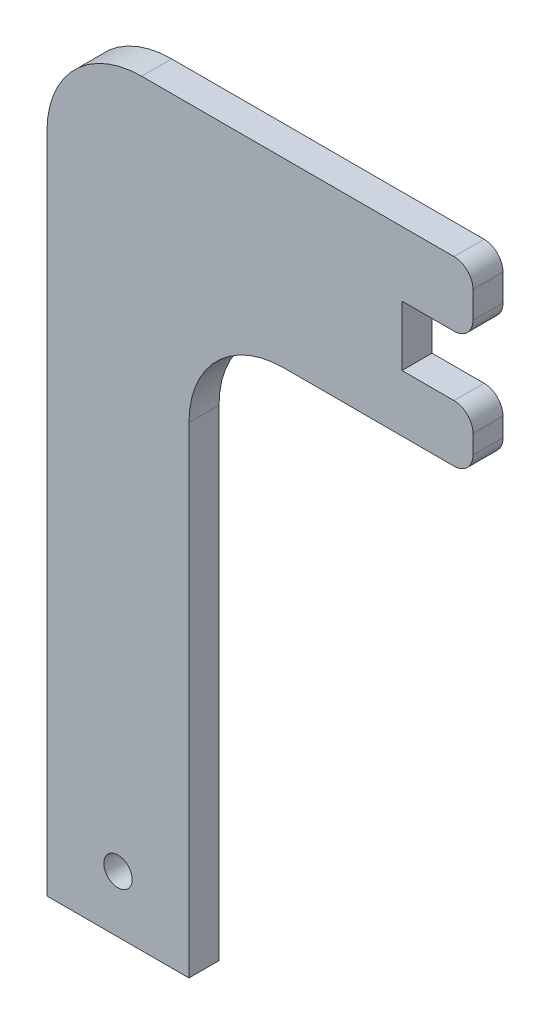
ISO-10303-21;
HEADER;
FILE_DESCRIPTION(('STEP AP214'),'2;1');
FILE_NAME('part.step','',(''),(''),'','','');
FILE_SCHEMA(('AUTOMOTIVE_DESIGN { 1 0 10303 214 1 1 1 1 }'));
ENDSEC;
DATA;
#1=APPLICATION_CONTEXT('core data for automotive mechanical design processes');
#2=APPLICATION_PROTOCOL_DEFINITION('international standard','automotive_design',2000,#1);
#3=PRODUCT_CONTEXT('',#1,'mechanical');
#4=PRODUCT('Part','Part','',(#3));
#5=PRODUCT_RELATED_PRODUCT_CATEGORY('part','',(#4));
#6=PRODUCT_DEFINITION_FORMATION('','',#4);
#7=PRODUCT_DEFINITION_CONTEXT('part definition',#1,'design');
#8=PRODUCT_DEFINITION('design','',#6,#7);
#9=PRODUCT_DEFINITION_SHAPE('','',#8);
#10=(LENGTH_UNIT() NAMED_UNIT(*) SI_UNIT(.MILLI.,.METRE.));
#11=(NAMED_UNIT(*) PLANE_ANGLE_UNIT() SI_UNIT($,.RADIAN.));
#12=(NAMED_UNIT(*) SI_UNIT($,.STERADIAN.) SOLID_ANGLE_UNIT());
#13=UNCERTAINTY_MEASURE_WITH_UNIT(LENGTH_MEASURE(1.E-05),#10,'distance_accuracy_value','');
#14=(GEOMETRIC_REPRESENTATION_CONTEXT(3) GLOBAL_UNCERTAINTY_ASSIGNED_CONTEXT((#13)) GLOBAL_UNIT_ASSIGNED_CONTEXT((#10,
#11,#12)) REPRESENTATION_CONTEXT('',''));
#15=CARTESIAN_POINT('',(0.,0.,0.));
#16=DIRECTION('',(0.,0.,1.));
#17=DIRECTION('',(1.,0.,0.));
#18=AXIS2_PLACEMENT_3D('',#15,#16,#17);
#19=CARTESIAN_POINT('',(0.,0.,3.175));
#20=DIRECTION('',(-1.,0.,0.));
#21=DIRECTION('',(0.,-1.,0.));
#22=AXIS2_PLACEMENT_3D('',#19,#20,#21);
#23=PLANE('',#22);
#24=DIRECTION('',(0.,1.,0.));
#25=VECTOR('',#24,1.);
#26=CARTESIAN_POINT('',(0.,0.,3.175));
#27=LINE('',#26,#25);
#28=CARTESIAN_POINT('',(0.,-17.175,3.175));
#29=VERTEX_POINT('',#28);
#30=CARTESIAN_POINT('',(0.,-15.175,3.175));
#31=VERTEX_POINT('',#30);
#32=EDGE_CURVE('E190',#29,#31,#27,.T.);
#33=ORIENTED_EDGE('',*,*,#32,.F.);
#34=DIRECTION('',(0.,0.,1.));
#35=VECTOR('',#34,1.);
#36=CARTESIAN_POINT('',(0.,-17.175,3.175));
#37=LINE('',#36,#35);
#38=CARTESIAN_POINT('',(0.,-17.175,0.));
#39=VERTEX_POINT('',#38);
#40=EDGE_CURVE('E250',#29,#39,#37,.F.);
#41=ORIENTED_EDGE('',*,*,#40,.T.);
#42=DIRECTION('',(0.,1.,0.));
#43=VECTOR('',#42,1.);
#44=CARTESIAN_POINT('',(0.,0.,0.));
#45=LINE('',#44,#43);
#46=CARTESIAN_POINT('',(0.,-15.175,0.));
#47=VERTEX_POINT('',#46);
#48=EDGE_CURVE('E294',#39,#47,#45,.T.);
#49=ORIENTED_EDGE('',*,*,#48,.T.);
#50=DIRECTION('',(0.,0.,1.));
#51=VECTOR('',#50,1.);
#52=CARTESIAN_POINT('',(0.,-15.175,3.175));
#53=LINE('',#52,#51);
#54=EDGE_CURVE('E246',#47,#31,#53,.T.);
#55=ORIENTED_EDGE('',*,*,#54,.T.);
#56=EDGE_LOOP('',(#33,#41,#49,#55));
#57=FACE_BOUND('',#56,.T.);
#58=ADVANCED_FACE('F38',(#57),#23,.F.);
#59=CARTESIAN_POINT('',(0.,-4.825,0.));
#60=VERTEX_POINT('',#59);
#61=CARTESIAN_POINT('',(0.,-2.,0.));
#62=VERTEX_POINT('',#61);
#63=EDGE_CURVE('E291',#60,#62,#45,.T.);
#64=ORIENTED_EDGE('',*,*,#63,.T.);
#65=DIRECTION('',(0.,0.,-1.));
#66=VECTOR('',#65,1.);
#67=CARTESIAN_POINT('',(0.,-2.,3.175));
#68=LINE('',#67,#66);
#69=CARTESIAN_POINT('',(0.,-2.,3.175));
#70=VERTEX_POINT('',#69);
#71=EDGE_CURVE('E272',#62,#70,#68,.F.);
#72=ORIENTED_EDGE('',*,*,#71,.T.);
#73=CARTESIAN_POINT('',(0.,-4.825,3.175));
#74=VERTEX_POINT('',#73);
#75=EDGE_CURVE('E184',#74,#70,#27,.T.);
#76=ORIENTED_EDGE('',*,*,#75,.F.);
#77=DIRECTION('',(0.,0.,-1.));
#78=VECTOR('',#77,1.);
#79=CARTESIAN_POINT('',(0.,-4.825,3.175));
#80=LINE('',#79,#78);
#81=EDGE_CURVE('E268',#74,#60,#80,.T.);
#82=ORIENTED_EDGE('',*,*,#81,.T.);
#83=EDGE_LOOP('',(#64,#72,#76,#82));
#84=FACE_BOUND('',#83,.T.);
#85=ADVANCED_FACE('F344',(#84),#23,.F.);
#86=CARTESIAN_POINT('',(0.,0.,3.175));
#87=DIRECTION('',(0.,-1.,0.));
#88=DIRECTION('',(1.,0.,0.));
#89=AXIS2_PLACEMENT_3D('',#86,#87,#88);
#90=PLANE('',#89);
#91=DIRECTION('',(-1.,0.,0.));
#92=VECTOR('',#91,1.);
#93=CARTESIAN_POINT('',(0.,0.,3.175));
#94=LINE('',#93,#92);
#95=CARTESIAN_POINT('',(-2.,0.,3.175));
#96=VERTEX_POINT('',#95);
#97=CARTESIAN_POINT('',(-35.,0.,3.175));
#98=VERTEX_POINT('',#97);
#99=EDGE_CURVE('E280',#96,#98,#94,.T.);
#100=ORIENTED_EDGE('',*,*,#99,.F.);
#101=DIRECTION('',(0.,0.,-1.));
#102=VECTOR('',#101,1.);
#103=CARTESIAN_POINT('',(-2.,0.,3.175));
#104=LINE('',#103,#102);
#105=CARTESIAN_POINT('',(-2.,0.,0.));
#106=VERTEX_POINT('',#105);
#107=EDGE_CURVE('E264',#96,#106,#104,.T.);
#108=ORIENTED_EDGE('',*,*,#107,.T.);
#109=DIRECTION('',(-1.,0.,0.));
#110=VECTOR('',#109,1.);
#111=CARTESIAN_POINT('',(0.,0.,0.));
#112=LINE('',#111,#110);
#113=CARTESIAN_POINT('',(-35.,0.,0.));
#114=VERTEX_POINT('',#113);
#115=EDGE_CURVE('E192',#106,#114,#112,.T.);
#116=ORIENTED_EDGE('',*,*,#115,.T.);
#117=DIRECTION('',(0.,0.,-1.));
#118=VECTOR('',#117,1.);
#119=CARTESIAN_POINT('',(-35.,0.,3.175));
#120=LINE('',#119,#118);
#121=EDGE_CURVE('E210',#114,#98,#120,.F.);
#122=ORIENTED_EDGE('',*,*,#121,.T.);
#123=EDGE_LOOP('',(#100,#108,#116,#122));
#124=FACE_BOUND('',#123,.T.);
#125=ADVANCED_FACE('F351',(#124),#90,.F.);
#126=CARTESIAN_POINT('',(-45.,0.,3.175));
#127=DIRECTION('',(1.,0.,0.));
#128=DIRECTION('',(0.,1.,0.));
#129=AXIS2_PLACEMENT_3D('',#126,#127,#128);
#130=PLANE('',#129);
#131=DIRECTION('',(0.,-1.,0.));
#132=VECTOR('',#131,1.);
#133=CARTESIAN_POINT('',(-45.,0.,3.175));
#134=LINE('',#133,#132);
#135=CARTESIAN_POINT('',(-45.,-10.,3.175));
#136=VERTEX_POINT('',#135);
#137=CARTESIAN_POINT('',(-45.,-80.,3.175));
#138=VERTEX_POINT('',#137);
#139=EDGE_CURVE('E277',#136,#138,#134,.T.);
#140=ORIENTED_EDGE('',*,*,#139,.F.);
#141=DIRECTION('',(0.,0.,-1.));
#142=VECTOR('',#141,1.);
#143=CARTESIAN_POINT('',(-45.,-10.,3.175));
#144=LINE('',#143,#142);
#145=CARTESIAN_POINT('',(-45.,-10.,0.));
#146=VERTEX_POINT('',#145);
#147=EDGE_CURVE('E202',#136,#146,#144,.T.);
#148=ORIENTED_EDGE('',*,*,#147,.T.);
#149=DIRECTION('',(0.,-1.,0.));
#150=VECTOR('',#149,1.);
#151=CARTESIAN_POINT('',(-45.,0.,0.));
#152=LINE('',#151,#150);
#153=CARTESIAN_POINT('',(-45.,-80.,0.));
#154=VERTEX_POINT('',#153);
#155=EDGE_CURVE('E185',#146,#154,#152,.T.);
#156=ORIENTED_EDGE('',*,*,#155,.T.);
#157=DIRECTION('',(0.,0.,-1.));
#158=VECTOR('',#157,1.);
#159=CARTESIAN_POINT('',(-45.,-80.,3.175));
#160=LINE('',#159,#158);
#161=EDGE_CURVE('E182',#138,#154,#160,.T.);
#162=ORIENTED_EDGE('',*,*,#161,.F.);
#163=EDGE_LOOP('',(#140,#148,#156,#162));
#164=FACE_BOUND('',#163,.T.);
#165=ADVANCED_FACE('F358',(#164),#130,.F.);
#166=CARTESIAN_POINT('',(0.,-80.,3.175));
#167=DIRECTION('',(0.,1.,0.));
#168=DIRECTION('',(0.,0.,1.));
#169=AXIS2_PLACEMENT_3D('',#166,#167,#168);
#170=PLANE('',#169);
#171=DIRECTION('',(1.,0.,0.));
#172=VECTOR('',#171,1.);
#173=CARTESIAN_POINT('',(0.,-80.,0.));
#174=LINE('',#173,#172);
#175=CARTESIAN_POINT('',(-30.,-80.,0.));
#176=VERTEX_POINT('',#175);
#177=EDGE_CURVE('E159',#154,#176,#174,.T.);
#178=ORIENTED_EDGE('',*,*,#177,.T.);
#179=DIRECTION('',(0.,0.,1.));
#180=VECTOR('',#179,1.);
#181=CARTESIAN_POINT('',(-30.,-80.,0.));
#182=LINE('',#181,#180);
#183=CARTESIAN_POINT('',(-30.,-80.,3.175));
#184=VERTEX_POINT('',#183);
#185=EDGE_CURVE('E166',#176,#184,#182,.T.);
#186=ORIENTED_EDGE('',*,*,#185,.T.);
#187=DIRECTION('',(1.,0.,0.));
#188=VECTOR('',#187,1.);
#189=CARTESIAN_POINT('',(0.,-80.,3.175));
#190=LINE('',#189,#188);
#191=EDGE_CURVE('E199',#138,#184,#190,.T.);
#192=ORIENTED_EDGE('',*,*,#191,.F.);
#193=ORIENTED_EDGE('',*,*,#161,.T.);
#194=EDGE_LOOP('',(#178,#186,#192,#193));
#195=FACE_BOUND('',#194,.T.);
#196=ADVANCED_FACE('F180',(#195),#170,.F.);
#197=CARTESIAN_POINT('',(0.,0.,3.175));
#198=DIRECTION('',(0.,0.,-1.));
#199=DIRECTION('',(-1.,0.,0.));
#200=AXIS2_PLACEMENT_3D('',#197,#198,#199);
#201=PLANE('',#200);
#202=CARTESIAN_POINT('',(-37.5,-74.,3.175));
#203=DIRECTION('',(0.,0.,1.));
#204=DIRECTION('',(1.,0.,0.));
#205=AXIS2_PLACEMENT_3D('',#202,#203,#204);
#206=CIRCLE('',#205,1.5);
#207=CARTESIAN_POINT('',(-36.,-74.,3.175));
#208=VERTEX_POINT('',#207);
#209=EDGE_CURVE('E472',#208,#208,#206,.T.);
#210=ORIENTED_EDGE('',*,*,#209,.F.);
#211=EDGE_LOOP('',(#210));
#212=FACE_BOUND('',#211,.T.);
#213=DIRECTION('',(-1.,0.,0.));
#214=VECTOR('',#213,1.);
#215=CARTESIAN_POINT('',(0.,-19.175,3.175));
#216=LINE('',#215,#214);
#217=CARTESIAN_POINT('',(-2.,-19.175,3.175));
#218=VERTEX_POINT('',#217);
#219=CARTESIAN_POINT('',(-20.,-19.175,3.175));
#220=VERTEX_POINT('',#219);
#221=EDGE_CURVE('E464',#218,#220,#216,.T.);
#222=ORIENTED_EDGE('',*,*,#221,.F.);
#223=CARTESIAN_POINT('',(-2.,-17.175,3.175));
#224=DIRECTION('',(0.,0.,-1.));
#225=DIRECTION('',(-1.,0.,0.));
#226=AXIS2_PLACEMENT_3D('',#223,#224,#225);
#227=CIRCLE('',#226,2.);
#228=EDGE_CURVE('E243',#218,#29,#227,.F.);
#229=ORIENTED_EDGE('',*,*,#228,.T.);
#230=ORIENTED_EDGE('',*,*,#32,.T.);
#231=CARTESIAN_POINT('',(-2.,-15.175,3.175));
#232=DIRECTION('',(0.,0.,-1.));
#233=DIRECTION('',(-1.,0.,0.));
#234=AXIS2_PLACEMENT_3D('',#231,#232,#233);
#235=CIRCLE('',#234,2.);
#236=CARTESIAN_POINT('',(-2.,-13.175,3.175));
#237=VERTEX_POINT('',#236);
#238=EDGE_CURVE('E237',#31,#237,#235,.F.);
#239=ORIENTED_EDGE('',*,*,#238,.T.);
#240=DIRECTION('',(1.,0.,0.));
#241=VECTOR('',#240,1.);
#242=CARTESIAN_POINT('',(-7.5,-13.175,3.175));
#243=LINE('',#242,#241);
#244=CARTESIAN_POINT('',(-7.5,-13.175,3.175));
#245=VERTEX_POINT('',#244);
#246=EDGE_CURVE('E312',#245,#237,#243,.T.);
#247=ORIENTED_EDGE('',*,*,#246,.F.);
#248=DIRECTION('',(0.,-1.,0.));
#249=VECTOR('',#248,1.);
#250=CARTESIAN_POINT('',(-7.5,-6.825,3.175));
#251=LINE('',#250,#249);
#252=CARTESIAN_POINT('',(-7.5,-6.825,3.175));
#253=VERTEX_POINT('',#252);
#254=EDGE_CURVE('E317',#253,#245,#251,.T.);
#255=ORIENTED_EDGE('',*,*,#254,.F.);
#256=DIRECTION('',(-1.,0.,0.));
#257=VECTOR('',#256,1.);
#258=CARTESIAN_POINT('',(-7.5,-6.825,3.175));
#259=LINE('',#258,#257);
#260=CARTESIAN_POINT('',(-2.,-6.825,3.175));
#261=VERTEX_POINT('',#260);
#262=EDGE_CURVE('E177',#261,#253,#259,.T.);
#263=ORIENTED_EDGE('',*,*,#262,.F.);
#264=CARTESIAN_POINT('',(-2.,-4.825,3.175));
#265=DIRECTION('',(0.,0.,-1.));
#266=DIRECTION('',(-1.,0.,0.));
#267=AXIS2_PLACEMENT_3D('',#264,#265,#266);
#268=CIRCLE('',#267,2.);
#269=EDGE_CURVE('E234',#261,#74,#268,.F.);
#270=ORIENTED_EDGE('',*,*,#269,.T.);
#271=ORIENTED_EDGE('',*,*,#75,.T.);
#272=CARTESIAN_POINT('',(-2.,-2.,3.175));
#273=DIRECTION('',(0.,0.,-1.));
#274=DIRECTION('',(-1.,0.,0.));
#275=AXIS2_PLACEMENT_3D('',#272,#273,#274);
#276=CIRCLE('',#275,2.);
#277=EDGE_CURVE('E240',#70,#96,#276,.F.);
#278=ORIENTED_EDGE('',*,*,#277,.T.);
#279=ORIENTED_EDGE('',*,*,#99,.T.);
#280=CARTESIAN_POINT('',(-35.,-10.,3.175));
#281=DIRECTION('',(0.,0.,-1.));
#282=DIRECTION('',(-1.,0.,0.));
#283=AXIS2_PLACEMENT_3D('',#280,#281,#282);
#284=CIRCLE('',#283,10.);
#285=EDGE_CURVE('E214',#98,#136,#284,.F.);
#286=ORIENTED_EDGE('',*,*,#285,.T.);
#287=ORIENTED_EDGE('',*,*,#139,.T.);
#288=ORIENTED_EDGE('',*,*,#191,.T.);
#289=DIRECTION('',(0.,-1.,0.));
#290=VECTOR('',#289,1.);
#291=CARTESIAN_POINT('',(-30.,-80.,3.175));
#292=LINE('',#291,#290);
#293=CARTESIAN_POINT('',(-30.,-29.175,3.175));
#294=VERTEX_POINT('',#293);
#295=EDGE_CURVE('E172',#294,#184,#292,.T.);
#296=ORIENTED_EDGE('',*,*,#295,.F.);
#297=CARTESIAN_POINT('',(-20.,-29.175,3.175));
#298=DIRECTION('',(0.,0.,-1.));
#299=DIRECTION('',(-1.,0.,0.));
#300=AXIS2_PLACEMENT_3D('',#297,#298,#299);
#301=CIRCLE('',#300,10.);
#302=EDGE_CURVE('E224',#294,#220,#301,.T.);
#303=ORIENTED_EDGE('',*,*,#302,.T.);
#304=EDGE_LOOP('',(#222,#229,#230,#239,#247,#255,#263,#270,#271,#278,#279,#286,#287,#288,#296,#303));
#305=FACE_BOUND('',#304,.T.);
#306=ADVANCED_FACE('F310',(#212,#305),#201,.F.);
#307=CARTESIAN_POINT('',(0.,0.,0.));
#308=DIRECTION('',(0.,0.,-1.));
#309=DIRECTION('',(-1.,0.,0.));
#310=AXIS2_PLACEMENT_3D('',#307,#308,#309);
#311=PLANE('',#310);
#312=ORIENTED_EDGE('',*,*,#48,.F.);
#313=CARTESIAN_POINT('',(-2.,-17.175,0.));
#314=DIRECTION('',(0.,0.,-1.));
#315=DIRECTION('',(-1.,0.,0.));
#316=AXIS2_PLACEMENT_3D('',#313,#314,#315);
#317=CIRCLE('',#316,2.);
#318=CARTESIAN_POINT('',(-2.,-19.175,0.));
#319=VERTEX_POINT('',#318);
#320=EDGE_CURVE('E261',#39,#319,#317,.T.);
#321=ORIENTED_EDGE('',*,*,#320,.T.);
#322=DIRECTION('',(-1.,0.,0.));
#323=VECTOR('',#322,1.);
#324=CARTESIAN_POINT('',(0.,-19.175,0.));
#325=LINE('',#324,#323);
#326=CARTESIAN_POINT('',(-20.,-19.175,0.));
#327=VERTEX_POINT('',#326);
#328=EDGE_CURVE('E167',#319,#327,#325,.T.);
#329=ORIENTED_EDGE('',*,*,#328,.T.);
#330=CARTESIAN_POINT('',(-20.,-29.175,0.));
#331=DIRECTION('',(0.,0.,-1.));
#332=DIRECTION('',(-1.,0.,0.));
#333=AXIS2_PLACEMENT_3D('',#330,#331,#332);
#334=CIRCLE('',#333,10.);
#335=CARTESIAN_POINT('',(-30.,-29.175,0.));
#336=VERTEX_POINT('',#335);
#337=EDGE_CURVE('E161',#327,#336,#334,.F.);
#338=ORIENTED_EDGE('',*,*,#337,.T.);
#339=DIRECTION('',(0.,-1.,0.));
#340=VECTOR('',#339,1.);
#341=CARTESIAN_POINT('',(-30.,-80.,0.));
#342=LINE('',#341,#340);
#343=EDGE_CURVE('E152',#336,#176,#342,.T.);
#344=ORIENTED_EDGE('',*,*,#343,.T.);
#345=ORIENTED_EDGE('',*,*,#177,.F.);
#346=ORIENTED_EDGE('',*,*,#155,.F.);
#347=CARTESIAN_POINT('',(-35.,-10.,0.));
#348=DIRECTION('',(0.,0.,-1.));
#349=DIRECTION('',(-1.,0.,0.));
#350=AXIS2_PLACEMENT_3D('',#347,#348,#349);
#351=CIRCLE('',#350,10.);
#352=EDGE_CURVE('E206',#146,#114,#351,.T.);
#353=ORIENTED_EDGE('',*,*,#352,.T.);
#354=ORIENTED_EDGE('',*,*,#115,.F.);
#355=CARTESIAN_POINT('',(-2.,-2.,0.));
#356=DIRECTION('',(0.,0.,-1.));
#357=DIRECTION('',(-1.,0.,0.));
#358=AXIS2_PLACEMENT_3D('',#355,#356,#357);
#359=CIRCLE('',#358,2.);
#360=EDGE_CURVE('E258',#106,#62,#359,.T.);
#361=ORIENTED_EDGE('',*,*,#360,.T.);
#362=ORIENTED_EDGE('',*,*,#63,.F.);
#363=CARTESIAN_POINT('',(-2.,-4.825,0.));
#364=DIRECTION('',(0.,0.,-1.));
#365=DIRECTION('',(-1.,0.,0.));
#366=AXIS2_PLACEMENT_3D('',#363,#364,#365);
#367=CIRCLE('',#366,2.);
#368=CARTESIAN_POINT('',(-2.,-6.825,0.));
#369=VERTEX_POINT('',#368);
#370=EDGE_CURVE('E61',#60,#369,#367,.T.);
#371=ORIENTED_EDGE('',*,*,#370,.T.);
#372=DIRECTION('',(1.,0.,0.));
#373=VECTOR('',#372,1.);
#374=CARTESIAN_POINT('',(0.,-6.825,0.));
#375=LINE('',#374,#373);
#376=CARTESIAN_POINT('',(-7.5,-6.825,0.));
#377=VERTEX_POINT('',#376);
#378=EDGE_CURVE('E198',#377,#369,#375,.T.);
#379=ORIENTED_EDGE('',*,*,#378,.F.);
#380=DIRECTION('',(0.,-1.,0.));
#381=VECTOR('',#380,1.);
#382=CARTESIAN_POINT('',(-7.5,-6.825,0.));
#383=LINE('',#382,#381);
#384=CARTESIAN_POINT('',(-7.5,-13.175,0.));
#385=VERTEX_POINT('',#384);
#386=EDGE_CURVE('E316',#377,#385,#383,.T.);
#387=ORIENTED_EDGE('',*,*,#386,.T.);
#388=DIRECTION('',(1.,0.,0.));
#389=VECTOR('',#388,1.);
#390=CARTESIAN_POINT('',(-7.5,-13.175,0.));
#391=LINE('',#390,#389);
#392=CARTESIAN_POINT('',(-2.,-13.175,0.));
#393=VERTEX_POINT('',#392);
#394=EDGE_CURVE('E322',#385,#393,#391,.T.);
#395=ORIENTED_EDGE('',*,*,#394,.T.);
#396=CARTESIAN_POINT('',(-2.,-15.175,0.));
#397=DIRECTION('',(0.,0.,-1.));
#398=DIRECTION('',(-1.,0.,0.));
#399=AXIS2_PLACEMENT_3D('',#396,#397,#398);
#400=CIRCLE('',#399,2.);
#401=EDGE_CURVE('E255',#393,#47,#400,.T.);
#402=ORIENTED_EDGE('',*,*,#401,.T.);
#403=EDGE_LOOP('',(#312,#321,#329,#338,#344,#345,#346,#353,#354,#361,#362,#371,#379,#387,#395,#402));
#404=FACE_BOUND('',#403,.T.);
#405=CARTESIAN_POINT('',(-37.5,-74.,0.));
#406=DIRECTION('',(0.,0.,1.));
#407=DIRECTION('',(1.,0.,0.));
#408=AXIS2_PLACEMENT_3D('',#405,#406,#407);
#409=CIRCLE('',#408,1.5);
#410=CARTESIAN_POINT('',(-36.,-74.,0.));
#411=VERTEX_POINT('',#410);
#412=EDGE_CURVE('E468',#411,#411,#409,.T.);
#413=ORIENTED_EDGE('',*,*,#412,.T.);
#414=EDGE_LOOP('',(#413));
#415=FACE_BOUND('',#414,.T.);
#416=ADVANCED_FACE('F155',(#404,#415),#311,.T.);
#417=CARTESIAN_POINT('',(-7.5,-13.175,0.));
#418=DIRECTION('',(0.,-1.,0.));
#419=DIRECTION('',(1.,0.,0.));
#420=AXIS2_PLACEMENT_3D('',#417,#418,#419);
#421=PLANE('',#420);
#422=ORIENTED_EDGE('',*,*,#246,.T.);
#423=DIRECTION('',(0.,0.,1.));
#424=VECTOR('',#423,1.);
#425=CARTESIAN_POINT('',(-2.,-13.175,0.));
#426=LINE('',#425,#424);
#427=EDGE_CURVE('E47',#237,#393,#426,.F.);
#428=ORIENTED_EDGE('',*,*,#427,.T.);
#429=ORIENTED_EDGE('',*,*,#394,.F.);
#430=DIRECTION('',(0.,0.,1.));
#431=VECTOR('',#430,1.);
#432=CARTESIAN_POINT('',(-7.5,-13.175,0.));
#433=LINE('',#432,#431);
#434=EDGE_CURVE('E295',#385,#245,#433,.T.);
#435=ORIENTED_EDGE('',*,*,#434,.T.);
#436=EDGE_LOOP('',(#422,#428,#429,#435));
#437=FACE_BOUND('',#436,.T.);
#438=ADVANCED_FACE('F313',(#437),#421,.F.);
#439=CARTESIAN_POINT('',(-7.5,-6.825,0.));
#440=DIRECTION('',(0.,1.,0.));
#441=DIRECTION('',(-1.,0.,0.));
#442=AXIS2_PLACEMENT_3D('',#439,#440,#441);
#443=PLANE('',#442);
#444=ORIENTED_EDGE('',*,*,#378,.T.);
#445=DIRECTION('',(0.,0.,-1.));
#446=VECTOR('',#445,1.);
#447=CARTESIAN_POINT('',(-2.,-6.825,0.));
#448=LINE('',#447,#446);
#449=EDGE_CURVE('E11',#369,#261,#448,.F.);
#450=ORIENTED_EDGE('',*,*,#449,.T.);
#451=ORIENTED_EDGE('',*,*,#262,.T.);
#452=DIRECTION('',(0.,0.,1.));
#453=VECTOR('',#452,1.);
#454=CARTESIAN_POINT('',(-7.5,-6.825,0.));
#455=LINE('',#454,#453);
#456=EDGE_CURVE('E288',#377,#253,#455,.T.);
#457=ORIENTED_EDGE('',*,*,#456,.F.);
#458=EDGE_LOOP('',(#444,#450,#451,#457));
#459=FACE_BOUND('',#458,.T.);
#460=ADVANCED_FACE('F337',(#459),#443,.F.);
#461=CARTESIAN_POINT('',(-7.5,-6.825,0.));
#462=DIRECTION('',(-1.,0.,0.));
#463=DIRECTION('',(0.,0.,1.));
#464=AXIS2_PLACEMENT_3D('',#461,#462,#463);
#465=PLANE('',#464);
#466=ORIENTED_EDGE('',*,*,#254,.T.);
#467=ORIENTED_EDGE('',*,*,#434,.F.);
#468=ORIENTED_EDGE('',*,*,#386,.F.);
#469=ORIENTED_EDGE('',*,*,#456,.T.);
#470=EDGE_LOOP('',(#466,#467,#468,#469));
#471=FACE_BOUND('',#470,.T.);
#472=ADVANCED_FACE('F394',(#471),#465,.F.);
#473=CARTESIAN_POINT('',(-37.5,-74.,0.));
#474=DIRECTION('',(0.,0.,1.));
#475=DIRECTION('',(1.,0.,0.));
#476=AXIS2_PLACEMENT_3D('',#473,#474,#475);
#477=CYLINDRICAL_SURFACE('',#476,1.5);
#478=ORIENTED_EDGE('',*,*,#412,.F.);
#479=EDGE_LOOP('',(#478));
#480=FACE_BOUND('',#479,.T.);
#481=ORIENTED_EDGE('',*,*,#209,.T.);
#482=EDGE_LOOP('',(#481));
#483=FACE_BOUND('',#482,.T.);
#484=ADVANCED_FACE('F397',(#480,#483),#477,.F.);
#485=CARTESIAN_POINT('',(-30.,-80.,0.));
#486=DIRECTION('',(-1.,0.,0.));
#487=DIRECTION('',(0.,0.,1.));
#488=AXIS2_PLACEMENT_3D('',#485,#486,#487);
#489=PLANE('',#488);
#490=ORIENTED_EDGE('',*,*,#343,.F.);
#491=DIRECTION('',(0.,0.,1.));
#492=VECTOR('',#491,1.);
#493=CARTESIAN_POINT('',(-30.,-29.175,3.175));
#494=LINE('',#493,#492);
#495=EDGE_CURVE('E217',#336,#294,#494,.T.);
#496=ORIENTED_EDGE('',*,*,#495,.T.);
#497=ORIENTED_EDGE('',*,*,#295,.T.);
#498=ORIENTED_EDGE('',*,*,#185,.F.);
#499=EDGE_LOOP('',(#490,#496,#497,#498));
#500=FACE_BOUND('',#499,.T.);
#501=ADVANCED_FACE('F170',(#500),#489,.F.);
#502=CARTESIAN_POINT('',(0.,-19.175,0.));
#503=DIRECTION('',(0.,1.,0.));
#504=DIRECTION('',(-1.,0.,0.));
#505=AXIS2_PLACEMENT_3D('',#502,#503,#504);
#506=PLANE('',#505);
#507=ORIENTED_EDGE('',*,*,#328,.F.);
#508=DIRECTION('',(0.,0.,1.));
#509=VECTOR('',#508,1.);
#510=CARTESIAN_POINT('',(-2.,-19.175,0.));
#511=LINE('',#510,#509);
#512=EDGE_CURVE('E230',#319,#218,#511,.T.);
#513=ORIENTED_EDGE('',*,*,#512,.T.);
#514=ORIENTED_EDGE('',*,*,#221,.T.);
#515=DIRECTION('',(0.,0.,1.));
#516=VECTOR('',#515,1.);
#517=CARTESIAN_POINT('',(-20.,-19.175,0.));
#518=LINE('',#517,#516);
#519=EDGE_CURVE('E220',#220,#327,#518,.F.);
#520=ORIENTED_EDGE('',*,*,#519,.T.);
#521=EDGE_LOOP('',(#507,#513,#514,#520));
#522=FACE_BOUND('',#521,.T.);
#523=ADVANCED_FACE('F362',(#522),#506,.F.);
#524=CARTESIAN_POINT('',(-35.,-10.,3.175));
#525=DIRECTION('',(0.,0.,-1.));
#526=DIRECTION('',(-1.,0.,0.));
#527=AXIS2_PLACEMENT_3D('',#524,#525,#526);
#528=CYLINDRICAL_SURFACE('',#527,10.);
#529=ORIENTED_EDGE('',*,*,#285,.F.);
#530=ORIENTED_EDGE('',*,*,#121,.F.);
#531=ORIENTED_EDGE('',*,*,#352,.F.);
#532=ORIENTED_EDGE('',*,*,#147,.F.);
#533=EDGE_LOOP('',(#529,#530,#531,#532));
#534=FACE_BOUND('',#533,.T.);
#535=ADVANCED_FACE('F359',(#534),#528,.T.);
#536=CARTESIAN_POINT('',(-20.,-29.175,0.));
#537=DIRECTION('',(0.,0.,-1.));
#538=DIRECTION('',(-1.,0.,0.));
#539=AXIS2_PLACEMENT_3D('',#536,#537,#538);
#540=CYLINDRICAL_SURFACE('',#539,10.);
#541=ORIENTED_EDGE('',*,*,#337,.F.);
#542=ORIENTED_EDGE('',*,*,#519,.F.);
#543=ORIENTED_EDGE('',*,*,#302,.F.);
#544=ORIENTED_EDGE('',*,*,#495,.F.);
#545=EDGE_LOOP('',(#541,#542,#543,#544));
#546=FACE_BOUND('',#545,.T.);
#547=ADVANCED_FACE('F361',(#546),#540,.F.);
#548=CARTESIAN_POINT('',(-2.,-17.175,0.));
#549=DIRECTION('',(0.,0.,1.));
#550=DIRECTION('',(1.,0.,0.));
#551=AXIS2_PLACEMENT_3D('',#548,#549,#550);
#552=CYLINDRICAL_SURFACE('',#551,2.);
#553=ORIENTED_EDGE('',*,*,#320,.F.);
#554=ORIENTED_EDGE('',*,*,#40,.F.);
#555=ORIENTED_EDGE('',*,*,#228,.F.);
#556=ORIENTED_EDGE('',*,*,#512,.F.);
#557=EDGE_LOOP('',(#553,#554,#555,#556));
#558=FACE_BOUND('',#557,.T.);
#559=ADVANCED_FACE('F368',(#558),#552,.T.);
#560=CARTESIAN_POINT('',(-2.,-2.,3.175));
#561=DIRECTION('',(0.,0.,-1.));
#562=DIRECTION('',(-1.,0.,0.));
#563=AXIS2_PLACEMENT_3D('',#560,#561,#562);
#564=CYLINDRICAL_SURFACE('',#563,2.);
#565=ORIENTED_EDGE('',*,*,#277,.F.);
#566=ORIENTED_EDGE('',*,*,#71,.F.);
#567=ORIENTED_EDGE('',*,*,#360,.F.);
#568=ORIENTED_EDGE('',*,*,#107,.F.);
#569=EDGE_LOOP('',(#565,#566,#567,#568));
#570=FACE_BOUND('',#569,.T.);
#571=ADVANCED_FACE('F349',(#570),#564,.T.);
#572=CARTESIAN_POINT('',(-2.,-15.175,3.175));
#573=DIRECTION('',(0.,0.,1.));
#574=DIRECTION('',(1.,0.,0.));
#575=AXIS2_PLACEMENT_3D('',#572,#573,#574);
#576=CYLINDRICAL_SURFACE('',#575,2.);
#577=ORIENTED_EDGE('',*,*,#401,.F.);
#578=ORIENTED_EDGE('',*,*,#427,.F.);
#579=ORIENTED_EDGE('',*,*,#238,.F.);
#580=ORIENTED_EDGE('',*,*,#54,.F.);
#581=EDGE_LOOP('',(#577,#578,#579,#580));
#582=FACE_BOUND('',#581,.T.);
#583=ADVANCED_FACE('F307',(#582),#576,.T.);
#584=CARTESIAN_POINT('',(-2.,-4.825,3.175));
#585=DIRECTION('',(0.,0.,-1.));
#586=DIRECTION('',(-1.,0.,0.));
#587=AXIS2_PLACEMENT_3D('',#584,#585,#586);
#588=CYLINDRICAL_SURFACE('',#587,2.);
#589=ORIENTED_EDGE('',*,*,#269,.F.);
#590=ORIENTED_EDGE('',*,*,#449,.F.);
#591=ORIENTED_EDGE('',*,*,#370,.F.);
#592=ORIENTED_EDGE('',*,*,#81,.F.);
#593=EDGE_LOOP('',(#589,#590,#591,#592));
#594=FACE_BOUND('',#593,.T.);
#595=ADVANCED_FACE('F40',(#594),#588,.T.);
#596=CLOSED_SHELL('',(#58,#85,#125,#165,#196,#306,#416,#438,#460,#472,#484,#501,#523,#535,#547,
#559,#571,#583,#595));
#597=MANIFOLD_SOLID_BREP('B2',#596);
#598=ADVANCED_BREP_SHAPE_REPRESENTATION('',(#18,#597),#14);
#599=SHAPE_DEFINITION_REPRESENTATION(#9,#598);
ENDSEC;
END-ISO-10303-21;
